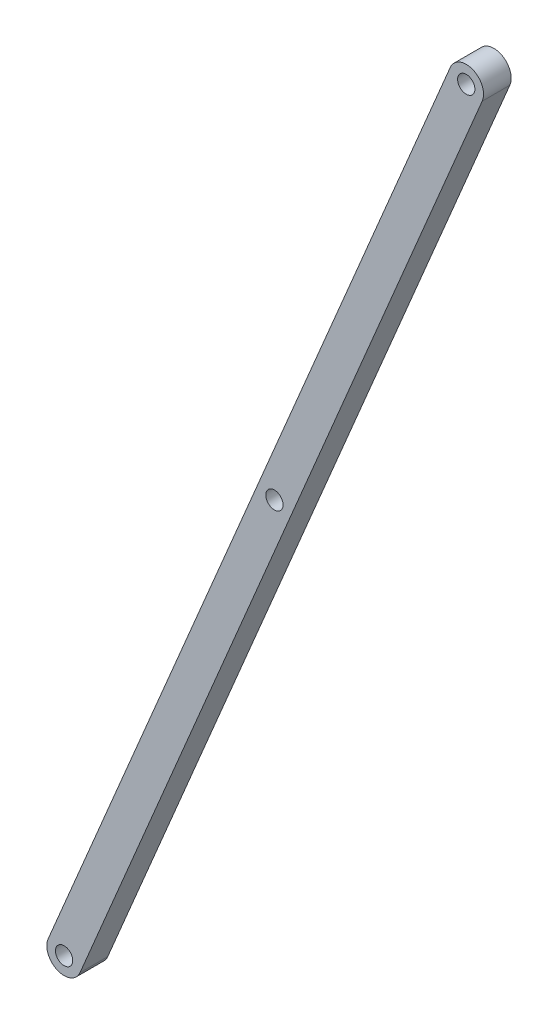
ISO-10303-21;
HEADER;
FILE_DESCRIPTION(('STEP AP214'),'2;1');
FILE_NAME('part.step','',(''),(''),'','','');
FILE_SCHEMA(('AUTOMOTIVE_DESIGN { 1 0 10303 214 1 1 1 1 }'));
ENDSEC;
DATA;
#1=APPLICATION_CONTEXT('core data for automotive mechanical design processes');
#2=APPLICATION_PROTOCOL_DEFINITION('international standard','automotive_design',2000,#1);
#3=PRODUCT_CONTEXT('',#1,'mechanical');
#4=PRODUCT('Part','Part','',(#3));
#5=PRODUCT_RELATED_PRODUCT_CATEGORY('part','',(#4));
#6=PRODUCT_DEFINITION_FORMATION('','',#4);
#7=PRODUCT_DEFINITION_CONTEXT('part definition',#1,'design');
#8=PRODUCT_DEFINITION('design','',#6,#7);
#9=PRODUCT_DEFINITION_SHAPE('','',#8);
#10=(LENGTH_UNIT() NAMED_UNIT(*) SI_UNIT(.MILLI.,.METRE.));
#11=(NAMED_UNIT(*) PLANE_ANGLE_UNIT() SI_UNIT($,.RADIAN.));
#12=(NAMED_UNIT(*) SI_UNIT($,.STERADIAN.) SOLID_ANGLE_UNIT());
#13=UNCERTAINTY_MEASURE_WITH_UNIT(LENGTH_MEASURE(1.E-05),#10,'distance_accuracy_value','');
#14=(GEOMETRIC_REPRESENTATION_CONTEXT(3) GLOBAL_UNCERTAINTY_ASSIGNED_CONTEXT((#13)) GLOBAL_UNIT_ASSIGNED_CONTEXT((#10,
#11,#12)) REPRESENTATION_CONTEXT('',''));
#15=CARTESIAN_POINT('',(0.,0.,0.));
#16=DIRECTION('',(0.,0.,1.));
#17=DIRECTION('',(1.,0.,0.));
#18=AXIS2_PLACEMENT_3D('',#15,#16,#17);
#19=CARTESIAN_POINT('',(0.,0.,18.0020474927602));
#20=DIRECTION('',(0.,0.,-1.));
#21=DIRECTION('',(-1.,0.,0.));
#22=AXIS2_PLACEMENT_3D('',#19,#20,#21);
#23=CYLINDRICAL_SURFACE('',#22,4.99999999999996);
#24=CARTESIAN_POINT('',(0.,0.,10.0020474927602));
#25=DIRECTION('',(0.,0.,1.));
#26=DIRECTION('',(1.,0.,0.));
#27=AXIS2_PLACEMENT_3D('',#24,#25,#26);
#28=CIRCLE('',#27,4.99999999999996);
#29=CARTESIAN_POINT('',(-4.60866190476186,1.93913265342943,10.0020474927602));
#30=VERTEX_POINT('',#29);
#31=CARTESIAN_POINT('',(4.60866190476188,-1.93913265342946,10.0020474927602));
#32=VERTEX_POINT('',#31);
#33=EDGE_CURVE('E100',#30,#32,#28,.T.);
#34=ORIENTED_EDGE('',*,*,#33,.T.);
#35=DIRECTION('',(0.,0.,-1.));
#36=VECTOR('',#35,1.);
#37=CARTESIAN_POINT('',(4.60866190476188,-1.93913265342946,18.0020474927602));
#38=LINE('',#37,#36);
#39=CARTESIAN_POINT('',(4.60866190476188,-1.93913265342946,18.0020474927602));
#40=VERTEX_POINT('',#39);
#41=EDGE_CURVE('E11',#40,#32,#38,.T.);
#42=ORIENTED_EDGE('',*,*,#41,.F.);
#43=CARTESIAN_POINT('',(0.,0.,18.0020474927602));
#44=DIRECTION('',(0.,0.,1.));
#45=DIRECTION('',(1.,0.,0.));
#46=AXIS2_PLACEMENT_3D('',#43,#44,#45);
#47=CIRCLE('',#46,4.99999999999996);
#48=CARTESIAN_POINT('',(-4.60866190476186,1.93913265342943,18.0020474927602));
#49=VERTEX_POINT('',#48);
#50=EDGE_CURVE('E87',#49,#40,#47,.T.);
#51=ORIENTED_EDGE('',*,*,#50,.F.);
#52=DIRECTION('',(0.,0.,-1.));
#53=VECTOR('',#52,1.);
#54=CARTESIAN_POINT('',(-4.60866190476186,1.93913265342943,18.0020474927602));
#55=LINE('',#54,#53);
#56=EDGE_CURVE('E96',#49,#30,#55,.T.);
#57=ORIENTED_EDGE('',*,*,#56,.T.);
#58=EDGE_LOOP('',(#34,#42,#51,#57));
#59=FACE_BOUND('',#58,.T.);
#60=ADVANCED_FACE('F34',(#59),#23,.T.);
#61=CARTESIAN_POINT('',(4.60866190476188,-1.93913265342946,18.0020474927602));
#62=DIRECTION('',(-0.921732380952381,0.387826530685892,0.));
#63=DIRECTION('',(-0.387826530685892,-0.921732380952381,0.));
#64=AXIS2_PLACEMENT_3D('',#61,#62,#63);
#65=PLANE('',#64);
#66=DIRECTION('',(0.387826530685892,0.921732380952381,0.));
#67=VECTOR('',#66,1.);
#68=CARTESIAN_POINT('',(4.60866190476188,-1.93913265342946,10.0020474927602));
#69=LINE('',#68,#67);
#70=CARTESIAN_POINT('',(120.956621110529,274.580581632285,10.0020474927602));
#71=VERTEX_POINT('',#70);
#72=EDGE_CURVE('E91',#32,#71,#69,.T.);
#73=ORIENTED_EDGE('',*,*,#72,.T.);
#74=DIRECTION('',(0.,0.,-1.));
#75=VECTOR('',#74,1.);
#76=CARTESIAN_POINT('',(120.956621110529,274.580581632285,18.0020474927602));
#77=LINE('',#76,#75);
#78=CARTESIAN_POINT('',(120.956621110529,274.580581632285,18.0020474927602));
#79=VERTEX_POINT('',#78);
#80=EDGE_CURVE('E43',#79,#71,#77,.T.);
#81=ORIENTED_EDGE('',*,*,#80,.F.);
#82=DIRECTION('',(0.387826530685892,0.921732380952381,0.));
#83=VECTOR('',#82,1.);
#84=CARTESIAN_POINT('',(4.60866190476188,-1.93913265342946,18.0020474927602));
#85=LINE('',#84,#83);
#86=EDGE_CURVE('E82',#40,#79,#85,.T.);
#87=ORIENTED_EDGE('',*,*,#86,.F.);
#88=ORIENTED_EDGE('',*,*,#41,.T.);
#89=EDGE_LOOP('',(#73,#81,#87,#88));
#90=FACE_BOUND('',#89,.T.);
#91=ADVANCED_FACE('F90',(#90),#65,.F.);
#92=CARTESIAN_POINT('',(116.347959205768,276.519714285714,18.0020474927602));
#93=DIRECTION('',(0.,0.,-1.));
#94=DIRECTION('',(-1.,0.,0.));
#95=AXIS2_PLACEMENT_3D('',#92,#93,#94);
#96=CYLINDRICAL_SURFACE('',#95,4.99999999999999);
#97=CARTESIAN_POINT('',(116.347959205768,276.519714285714,10.0020474927602));
#98=DIRECTION('',(0.,0.,1.));
#99=DIRECTION('',(1.,0.,0.));
#100=AXIS2_PLACEMENT_3D('',#97,#98,#99);
#101=CIRCLE('',#100,4.99999999999999);
#102=CARTESIAN_POINT('',(111.739297301006,278.458846939144,10.0020474927602));
#103=VERTEX_POINT('',#102);
#104=EDGE_CURVE('E69',#71,#103,#101,.T.);
#105=ORIENTED_EDGE('',*,*,#104,.T.);
#106=DIRECTION('',(0.,0.,-1.));
#107=VECTOR('',#106,1.);
#108=CARTESIAN_POINT('',(111.739297301006,278.458846939144,18.0020474927602));
#109=LINE('',#108,#107);
#110=CARTESIAN_POINT('',(111.739297301006,278.458846939144,18.0020474927602));
#111=VERTEX_POINT('',#110);
#112=EDGE_CURVE('E92',#111,#103,#109,.T.);
#113=ORIENTED_EDGE('',*,*,#112,.F.);
#114=CARTESIAN_POINT('',(116.347959205768,276.519714285714,18.0020474927602));
#115=DIRECTION('',(0.,0.,1.));
#116=DIRECTION('',(1.,0.,0.));
#117=AXIS2_PLACEMENT_3D('',#114,#115,#116);
#118=CIRCLE('',#117,4.99999999999999);
#119=EDGE_CURVE('E85',#79,#111,#118,.T.);
#120=ORIENTED_EDGE('',*,*,#119,.F.);
#121=ORIENTED_EDGE('',*,*,#80,.T.);
#122=EDGE_LOOP('',(#105,#113,#120,#121));
#123=FACE_BOUND('',#122,.T.);
#124=ADVANCED_FACE('F94',(#123),#96,.T.);
#125=CARTESIAN_POINT('',(-4.60866190476186,1.93913265342943,18.0020474927602));
#126=DIRECTION('',(0.921732380952381,-0.387826530685892,0.));
#127=DIRECTION('',(0.387826530685892,0.921732380952381,0.));
#128=AXIS2_PLACEMENT_3D('',#125,#126,#127);
#129=PLANE('',#128);
#130=DIRECTION('',(-0.387826530685892,-0.921732380952381,0.));
#131=VECTOR('',#130,1.);
#132=CARTESIAN_POINT('',(-4.60866190476186,1.93913265342943,10.0020474927602));
#133=LINE('',#132,#131);
#134=EDGE_CURVE('E75',#103,#30,#133,.T.);
#135=ORIENTED_EDGE('',*,*,#134,.T.);
#136=ORIENTED_EDGE('',*,*,#56,.F.);
#137=DIRECTION('',(-0.387826530685892,-0.921732380952381,0.));
#138=VECTOR('',#137,1.);
#139=CARTESIAN_POINT('',(-4.60866190476186,1.93913265342943,18.0020474927602));
#140=LINE('',#139,#138);
#141=EDGE_CURVE('E52',#111,#49,#140,.T.);
#142=ORIENTED_EDGE('',*,*,#141,.F.);
#143=ORIENTED_EDGE('',*,*,#112,.T.);
#144=EDGE_LOOP('',(#135,#136,#142,#143));
#145=FACE_BOUND('',#144,.T.);
#146=ADVANCED_FACE('F156',(#145),#129,.F.);
#147=CARTESIAN_POINT('',(0.,0.,18.0020474927602));
#148=DIRECTION('',(0.,0.,1.));
#149=DIRECTION('',(1.,0.,0.));
#150=AXIS2_PLACEMENT_3D('',#147,#148,#149);
#151=PLANE('',#150);
#152=CARTESIAN_POINT('',(116.347959205768,276.519714285714,18.0020474927602));
#153=DIRECTION('',(0.,0.,1.));
#154=DIRECTION('',(1.,0.,0.));
#155=AXIS2_PLACEMENT_3D('',#152,#153,#154);
#156=CIRCLE('',#155,2.5);
#157=CARTESIAN_POINT('',(118.847959205768,276.519714285714,18.0020474927602));
#158=VERTEX_POINT('',#157);
#159=EDGE_CURVE('E103',#158,#158,#156,.T.);
#160=ORIENTED_EDGE('',*,*,#159,.F.);
#161=EDGE_LOOP('',(#160));
#162=FACE_BOUND('',#161,.T.);
#163=CARTESIAN_POINT('',(0.,0.,18.0020474927602));
#164=DIRECTION('',(0.,0.,1.));
#165=DIRECTION('',(1.,0.,0.));
#166=AXIS2_PLACEMENT_3D('',#163,#164,#165);
#167=CIRCLE('',#166,2.5);
#168=CARTESIAN_POINT('',(2.5,0.,18.0020474927602));
#169=VERTEX_POINT('',#168);
#170=EDGE_CURVE('E114',#169,#169,#167,.T.);
#171=ORIENTED_EDGE('',*,*,#170,.F.);
#172=EDGE_LOOP('',(#171));
#173=FACE_BOUND('',#172,.T.);
#174=CARTESIAN_POINT('',(60.8456096983234,144.609417510835,18.0020474927602));
#175=DIRECTION('',(0.,0.,1.));
#176=DIRECTION('',(1.,0.,0.));
#177=AXIS2_PLACEMENT_3D('',#174,#175,#176);
#178=CIRCLE('',#177,2.5);
#179=CARTESIAN_POINT('',(63.3456096983234,144.609417510835,18.0020474927602));
#180=VERTEX_POINT('',#179);
#181=EDGE_CURVE('E111',#180,#180,#178,.T.);
#182=ORIENTED_EDGE('',*,*,#181,.F.);
#183=EDGE_LOOP('',(#182));
#184=FACE_BOUND('',#183,.T.);
#185=ORIENTED_EDGE('',*,*,#50,.T.);
#186=ORIENTED_EDGE('',*,*,#86,.T.);
#187=ORIENTED_EDGE('',*,*,#119,.T.);
#188=ORIENTED_EDGE('',*,*,#141,.T.);
#189=EDGE_LOOP('',(#185,#186,#187,#188));
#190=FACE_BOUND('',#189,.T.);
#191=ADVANCED_FACE('F83',(#162,#173,#184,#190),#151,.T.);
#192=CARTESIAN_POINT('',(0.,0.,10.0020474927602));
#193=DIRECTION('',(0.,0.,1.));
#194=DIRECTION('',(1.,0.,0.));
#195=AXIS2_PLACEMENT_3D('',#192,#193,#194);
#196=PLANE('',#195);
#197=CARTESIAN_POINT('',(116.347959205768,276.519714285714,10.0020474927602));
#198=DIRECTION('',(0.,0.,1.));
#199=DIRECTION('',(1.,0.,0.));
#200=AXIS2_PLACEMENT_3D('',#197,#198,#199);
#201=CIRCLE('',#200,2.5);
#202=CARTESIAN_POINT('',(118.847959205768,276.519714285714,10.0020474927602));
#203=VERTEX_POINT('',#202);
#204=EDGE_CURVE('E37',#203,#203,#201,.T.);
#205=ORIENTED_EDGE('',*,*,#204,.T.);
#206=EDGE_LOOP('',(#205));
#207=FACE_BOUND('',#206,.T.);
#208=CARTESIAN_POINT('',(0.,0.,10.0020474927602));
#209=DIRECTION('',(0.,0.,1.));
#210=DIRECTION('',(1.,0.,0.));
#211=AXIS2_PLACEMENT_3D('',#208,#209,#210);
#212=CIRCLE('',#211,2.5);
#213=CARTESIAN_POINT('',(2.5,0.,10.0020474927602));
#214=VERTEX_POINT('',#213);
#215=EDGE_CURVE('E112',#214,#214,#212,.T.);
#216=ORIENTED_EDGE('',*,*,#215,.T.);
#217=EDGE_LOOP('',(#216));
#218=FACE_BOUND('',#217,.T.);
#219=CARTESIAN_POINT('',(60.8456096983234,144.609417510835,10.0020474927602));
#220=DIRECTION('',(0.,0.,1.));
#221=DIRECTION('',(1.,0.,0.));
#222=AXIS2_PLACEMENT_3D('',#219,#220,#221);
#223=CIRCLE('',#222,2.5);
#224=CARTESIAN_POINT('',(63.3456096983234,144.609417510835,10.0020474927602));
#225=VERTEX_POINT('',#224);
#226=EDGE_CURVE('E109',#225,#225,#223,.T.);
#227=ORIENTED_EDGE('',*,*,#226,.T.);
#228=EDGE_LOOP('',(#227));
#229=FACE_BOUND('',#228,.T.);
#230=ORIENTED_EDGE('',*,*,#33,.F.);
#231=ORIENTED_EDGE('',*,*,#134,.F.);
#232=ORIENTED_EDGE('',*,*,#104,.F.);
#233=ORIENTED_EDGE('',*,*,#72,.F.);
#234=EDGE_LOOP('',(#230,#231,#232,#233));
#235=FACE_BOUND('',#234,.T.);
#236=ADVANCED_FACE('F130',(#207,#218,#229,#235),#196,.F.);
#237=CARTESIAN_POINT('',(60.8456096983234,144.609417510835,-9.99795250723981));
#238=DIRECTION('',(0.,0.,1.));
#239=DIRECTION('',(1.,0.,0.));
#240=AXIS2_PLACEMENT_3D('',#237,#238,#239);
#241=CYLINDRICAL_SURFACE('',#240,2.5);
#242=ORIENTED_EDGE('',*,*,#181,.T.);
#243=EDGE_LOOP('',(#242));
#244=FACE_BOUND('',#243,.T.);
#245=ORIENTED_EDGE('',*,*,#226,.F.);
#246=EDGE_LOOP('',(#245));
#247=FACE_BOUND('',#246,.T.);
#248=ADVANCED_FACE('F139',(#244,#247),#241,.F.);
#249=CARTESIAN_POINT('',(0.,0.,-9.99795250723981));
#250=DIRECTION('',(0.,0.,1.));
#251=DIRECTION('',(1.,0.,0.));
#252=AXIS2_PLACEMENT_3D('',#249,#250,#251);
#253=CYLINDRICAL_SURFACE('',#252,2.5);
#254=ORIENTED_EDGE('',*,*,#170,.T.);
#255=EDGE_LOOP('',(#254));
#256=FACE_BOUND('',#255,.T.);
#257=ORIENTED_EDGE('',*,*,#215,.F.);
#258=EDGE_LOOP('',(#257));
#259=FACE_BOUND('',#258,.T.);
#260=ADVANCED_FACE('F134',(#256,#259),#253,.F.);
#261=CARTESIAN_POINT('',(116.347959205768,276.519714285714,-9.99795250723981));
#262=DIRECTION('',(0.,0.,1.));
#263=DIRECTION('',(1.,0.,0.));
#264=AXIS2_PLACEMENT_3D('',#261,#262,#263);
#265=CYLINDRICAL_SURFACE('',#264,2.5);
#266=ORIENTED_EDGE('',*,*,#159,.T.);
#267=EDGE_LOOP('',(#266));
#268=FACE_BOUND('',#267,.T.);
#269=ORIENTED_EDGE('',*,*,#204,.F.);
#270=EDGE_LOOP('',(#269));
#271=FACE_BOUND('',#270,.T.);
#272=ADVANCED_FACE('F132',(#268,#271),#265,.F.);
#273=CLOSED_SHELL('',(#60,#91,#124,#146,#191,#236,#248,#260,#272));
#274=MANIFOLD_SOLID_BREP('B2',#273);
#275=ADVANCED_BREP_SHAPE_REPRESENTATION('',(#18,#274),#14);
#276=SHAPE_DEFINITION_REPRESENTATION(#9,#275);
ENDSEC;
END-ISO-10303-21;
